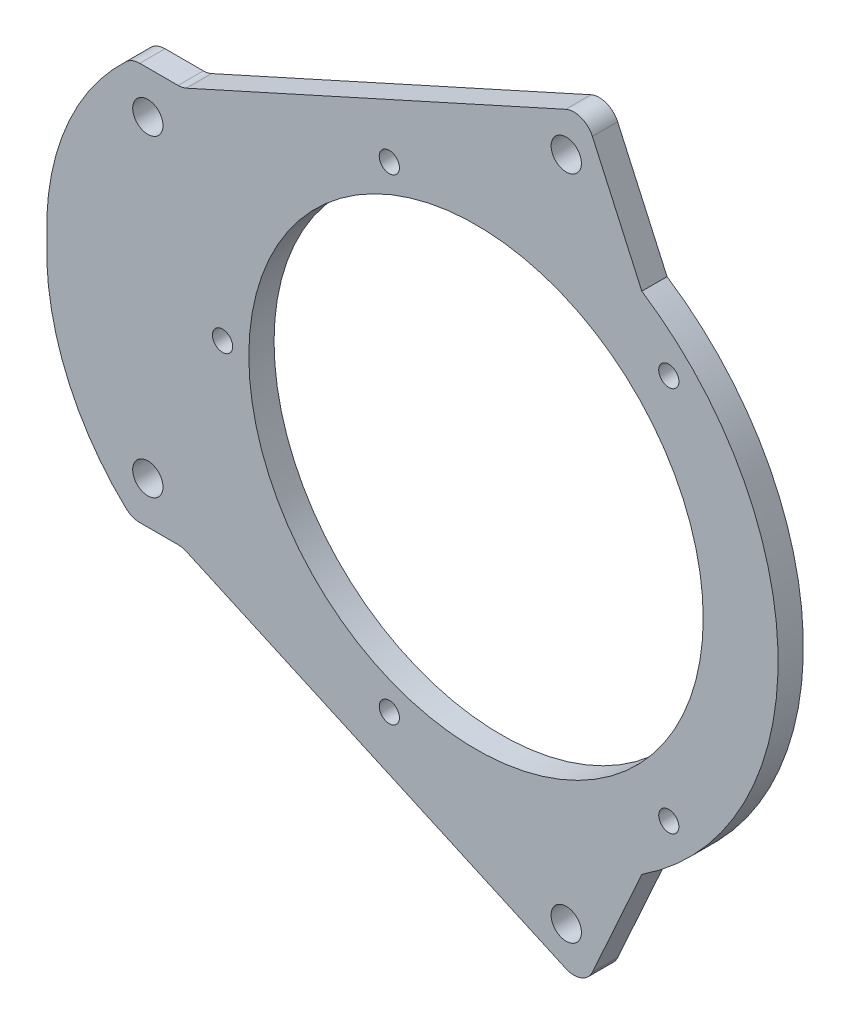
ISO-10303-21;
HEADER;
FILE_DESCRIPTION(('STEP AP214'),'2;1');
FILE_NAME('part.step','',(''),(''),'','','');
FILE_SCHEMA(('AUTOMOTIVE_DESIGN { 1 0 10303 214 1 1 1 1 }'));
ENDSEC;
DATA;
#1=APPLICATION_CONTEXT('core data for automotive mechanical design processes');
#2=APPLICATION_PROTOCOL_DEFINITION('international standard','automotive_design',2000,#1);
#3=PRODUCT_CONTEXT('',#1,'mechanical');
#4=PRODUCT('Part','Part','',(#3));
#5=PRODUCT_RELATED_PRODUCT_CATEGORY('part','',(#4));
#6=PRODUCT_DEFINITION_FORMATION('','',#4);
#7=PRODUCT_DEFINITION_CONTEXT('part definition',#1,'design');
#8=PRODUCT_DEFINITION('design','',#6,#7);
#9=PRODUCT_DEFINITION_SHAPE('','',#8);
#10=(LENGTH_UNIT() NAMED_UNIT(*) SI_UNIT(.MILLI.,.METRE.));
#11=(NAMED_UNIT(*) PLANE_ANGLE_UNIT() SI_UNIT($,.RADIAN.));
#12=(NAMED_UNIT(*) SI_UNIT($,.STERADIAN.) SOLID_ANGLE_UNIT());
#13=UNCERTAINTY_MEASURE_WITH_UNIT(LENGTH_MEASURE(1.E-05),#10,'distance_accuracy_value','');
#14=(GEOMETRIC_REPRESENTATION_CONTEXT(3) GLOBAL_UNCERTAINTY_ASSIGNED_CONTEXT((#13)) GLOBAL_UNIT_ASSIGNED_CONTEXT((#10,
#11,#12)) REPRESENTATION_CONTEXT('',''));
#15=CARTESIAN_POINT('',(0.,0.,0.));
#16=DIRECTION('',(0.,0.,1.));
#17=DIRECTION('',(1.,0.,0.));
#18=AXIS2_PLACEMENT_3D('',#15,#16,#17);
#19=CARTESIAN_POINT('',(-35.4932420101842,-40.0332836997333,2.5));
#20=DIRECTION('',(0.,0.,1.));
#21=DIRECTION('',(1.,0.,0.));
#22=AXIS2_PLACEMENT_3D('',#19,#20,#21);
#23=PLANE('',#22);
#24=CARTESIAN_POINT('',(-102.318076,-15.5,2.5));
#25=DIRECTION('',(0.,0.,1.));
#26=DIRECTION('',(1.,0.,0.));
#27=AXIS2_PLACEMENT_3D('',#24,#25,#26);
#28=CIRCLE('',#27,1.5);
#29=CARTESIAN_POINT('',(-100.818076,-15.5,2.5));
#30=VERTEX_POINT('',#29);
#31=EDGE_CURVE('E369',#30,#30,#28,.T.);
#32=ORIENTED_EDGE('',*,*,#31,.F.);
#33=EDGE_LOOP('',(#32));
#34=FACE_BOUND('',#33,.T.);
#35=CARTESIAN_POINT('',(-102.318076,15.5,2.5));
#36=DIRECTION('',(0.,0.,1.));
#37=DIRECTION('',(-1.,0.,0.));
#38=AXIS2_PLACEMENT_3D('',#35,#36,#37);
#39=CIRCLE('',#38,1.5);
#40=CARTESIAN_POINT('',(-103.818076,15.5,2.5));
#41=VERTEX_POINT('',#40);
#42=EDGE_CURVE('E470',#41,#41,#39,.T.);
#43=ORIENTED_EDGE('',*,*,#42,.F.);
#44=EDGE_LOOP('',(#43));
#45=FACE_BOUND('',#44,.T.);
#46=DIRECTION('',(-1.,0.,0.));
#47=VECTOR('',#46,1.);
#48=CARTESIAN_POINT('',(-98.8886243267286,19.6949884962928,2.5));
#49=LINE('',#48,#47);
#50=CARTESIAN_POINT('',(-99.3194027891663,19.6949884962928,2.5));
#51=VERTEX_POINT('',#50);
#52=CARTESIAN_POINT('',(-103.113561540397,19.6949884962928,2.5));
#53=VERTEX_POINT('',#52);
#54=EDGE_CURVE('E221',#51,#53,#49,.T.);
#55=ORIENTED_EDGE('',*,*,#54,.T.);
#56=CARTESIAN_POINT('',(-103.113561540397,17.6949884962928,2.5));
#57=DIRECTION('',(0.,0.,1.));
#58=DIRECTION('',(1.,0.,0.));
#59=AXIS2_PLACEMENT_3D('',#56,#57,#58);
#60=CIRCLE('',#59,2.);
#61=CARTESIAN_POINT('',(-104.485481090456,19.1502674208176,2.5));
#62=VERTEX_POINT('',#61);
#63=EDGE_CURVE('E200',#53,#62,#60,.T.);
#64=ORIENTED_EDGE('',*,*,#63,.T.);
#65=CARTESIAN_POINT('',(-87.3364867147194,0.959280864257396,2.5));
#66=DIRECTION('',(0.,0.,1.));
#67=DIRECTION('',(-1.,0.,0.));
#68=AXIS2_PLACEMENT_3D('',#65,#66,#67);
#69=CIRCLE('',#68,25.);
#70=CARTESIAN_POINT('',(-112.318075539762,0.,2.5));
#71=VERTEX_POINT('',#70);
#72=EDGE_CURVE('E223',#62,#71,#69,.T.);
#73=ORIENTED_EDGE('',*,*,#72,.T.);
#74=CARTESIAN_POINT('',(-87.3364867147194,-0.959280864257391,2.5));
#75=DIRECTION('',(0.,0.,1.));
#76=DIRECTION('',(1.,0.,0.));
#77=AXIS2_PLACEMENT_3D('',#74,#75,#76);
#78=CIRCLE('',#77,25.);
#79=CARTESIAN_POINT('',(-104.485481090456,-19.1502674208176,2.5));
#80=VERTEX_POINT('',#79);
#81=EDGE_CURVE('E385',#71,#80,#78,.T.);
#82=ORIENTED_EDGE('',*,*,#81,.T.);
#83=CARTESIAN_POINT('',(-103.113561540397,-17.6949884962928,2.5));
#84=DIRECTION('',(0.,0.,1.));
#85=DIRECTION('',(1.,0.,0.));
#86=AXIS2_PLACEMENT_3D('',#83,#84,#85);
#87=CIRCLE('',#86,2.);
#88=CARTESIAN_POINT('',(-103.113561540397,-19.6949884962928,2.5));
#89=VERTEX_POINT('',#88);
#90=EDGE_CURVE('E198',#80,#89,#87,.T.);
#91=ORIENTED_EDGE('',*,*,#90,.T.);
#92=DIRECTION('',(1.,0.,0.));
#93=VECTOR('',#92,1.);
#94=CARTESIAN_POINT('',(-98.8886243267286,-19.6949884962928,2.5));
#95=LINE('',#94,#93);
#96=CARTESIAN_POINT('',(-99.3194027891664,-19.6949884962928,2.5));
#97=VERTEX_POINT('',#96);
#98=EDGE_CURVE('E192',#89,#97,#95,.T.);
#99=ORIENTED_EDGE('',*,*,#98,.T.);
#100=CARTESIAN_POINT('',(-99.3194027891664,-21.6949884962928,2.5));
#101=DIRECTION('',(0.,0.,1.));
#102=DIRECTION('',(1.,0.,0.));
#103=AXIS2_PLACEMENT_3D('',#100,#101,#102);
#104=CIRCLE('',#103,2.);
#105=CARTESIAN_POINT('',(-98.4960435739133,-19.8723312046832,2.5));
#106=VERTEX_POINT('',#105);
#107=EDGE_CURVE('E40',#97,#106,#104,.F.);
#108=ORIENTED_EDGE('',*,*,#107,.T.);
#109=DIRECTION('',(0.911328645804831,-0.411679607626528,0.));
#110=VECTOR('',#109,1.);
#111=CARTESIAN_POINT('',(-99.1994919001305,-19.5545585413792,2.5));
#112=LINE('',#111,#110);
#113=CARTESIAN_POINT('',(-82.1340306035882,-27.2636352206508,2.5));
#114=VERTEX_POINT('',#113);
#115=EDGE_CURVE('E174',#106,#114,#112,.T.);
#116=ORIENTED_EDGE('',*,*,#115,.T.);
#117=DIRECTION('',(0.91132864592297,-0.411679607365006,0.));
#118=VECTOR('',#117,1.);
#119=CARTESIAN_POINT('',(-82.1340306035882,-27.2636352206508,2.5));
#120=LINE('',#119,#118);
#121=CARTESIAN_POINT('',(-60.9376938033347,-36.8387754848606,2.5));
#122=VERTEX_POINT('',#121);
#123=EDGE_CURVE('E293',#114,#122,#120,.T.);
#124=ORIENTED_EDGE('',*,*,#123,.T.);
#125=CARTESIAN_POINT('',(-60.1143345908294,-35.0161181993336,2.5));
#126=DIRECTION('',(0.,0.,1.));
#127=DIRECTION('',(1.,0.,0.));
#128=AXIS2_PLACEMENT_3D('',#125,#126,#127);
#129=CIRCLE('',#128,2.);
#130=CARTESIAN_POINT('',(-58.2916772989834,-35.8394774140636,2.5));
#131=VERTEX_POINT('',#130);
#132=EDGE_CURVE('E194',#122,#131,#129,.T.);
#133=ORIENTED_EDGE('',*,*,#132,.T.);
#134=DIRECTION('',(0.411679607365006,0.91132864592297,0.));
#135=VECTOR('',#134,1.);
#136=CARTESIAN_POINT('',(-53.3986236751587,-25.007801874024,2.5));
#137=LINE('',#136,#135);
#138=CARTESIAN_POINT('',(-53.3986236751587,-25.007801874024,2.5));
#139=VERTEX_POINT('',#138);
#140=EDGE_CURVE('E291',#131,#139,#137,.T.);
#141=ORIENTED_EDGE('',*,*,#140,.T.);
#142=CARTESIAN_POINT('',(-69.8180755397615,2.08537956513715E-08,2.5));
#143=DIRECTION('',(0.,0.,-1.));
#144=DIRECTION('',(1.,0.,0.));
#145=AXIS2_PLACEMENT_3D('',#142,#143,#144);
#146=CIRCLE('',#145,29.9163593135747);
#147=CARTESIAN_POINT('',(-53.3986236751587,25.007801874024,2.5));
#148=VERTEX_POINT('',#147);
#149=EDGE_CURVE('E306',#148,#139,#146,.T.);
#150=ORIENTED_EDGE('',*,*,#149,.F.);
#151=DIRECTION('',(-0.411679607365006,0.91132864592297,0.));
#152=VECTOR('',#151,1.);
#153=CARTESIAN_POINT('',(-53.3986236751587,25.007801874024,2.5));
#154=LINE('',#153,#152);
#155=CARTESIAN_POINT('',(-58.2916772989834,35.8394774140636,2.5));
#156=VERTEX_POINT('',#155);
#157=EDGE_CURVE('E162',#148,#156,#154,.T.);
#158=ORIENTED_EDGE('',*,*,#157,.T.);
#159=CARTESIAN_POINT('',(-60.1143345908294,35.0161181993336,2.5));
#160=DIRECTION('',(0.,0.,1.));
#161=DIRECTION('',(1.,0.,0.));
#162=AXIS2_PLACEMENT_3D('',#159,#160,#161);
#163=CIRCLE('',#162,2.);
#164=CARTESIAN_POINT('',(-60.9376938033347,36.8387754848606,2.5));
#165=VERTEX_POINT('',#164);
#166=EDGE_CURVE('E159',#156,#165,#163,.T.);
#167=ORIENTED_EDGE('',*,*,#166,.T.);
#168=DIRECTION('',(-0.91132864592297,-0.411679607365006,0.));
#169=VECTOR('',#168,1.);
#170=CARTESIAN_POINT('',(-82.1340306035882,27.2636352206508,2.5));
#171=LINE('',#170,#169);
#172=CARTESIAN_POINT('',(-82.1340306022796,27.263635217754,2.5));
#173=VERTEX_POINT('',#172);
#174=EDGE_CURVE('E152',#165,#173,#171,.T.);
#175=ORIENTED_EDGE('',*,*,#174,.T.);
#176=DIRECTION('',(-0.911328645804831,-0.411679607626528,0.));
#177=VECTOR('',#176,1.);
#178=CARTESIAN_POINT('',(-99.1994919001304,19.5545585413792,2.5));
#179=LINE('',#178,#177);
#180=CARTESIAN_POINT('',(-98.4960435739133,19.8723312046832,2.5));
#181=VERTEX_POINT('',#180);
#182=EDGE_CURVE('E156',#173,#181,#179,.T.);
#183=ORIENTED_EDGE('',*,*,#182,.T.);
#184=CARTESIAN_POINT('',(-99.3194027891663,21.6949884962928,2.5));
#185=DIRECTION('',(0.,0.,1.));
#186=DIRECTION('',(1.,0.,0.));
#187=AXIS2_PLACEMENT_3D('',#184,#185,#186);
#188=CIRCLE('',#187,2.);
#189=EDGE_CURVE('E236',#181,#51,#188,.F.);
#190=ORIENTED_EDGE('',*,*,#189,.T.);
#191=EDGE_LOOP('',(#55,#64,#73,#82,#91,#99,#108,#116,#124,#133,#141,#150,#158,#167,#175,#183,#190));
#192=FACE_BOUND('',#191,.T.);
#193=CARTESIAN_POINT('',(-69.8180755397615,2.08537956513715E-08,2.5));
#194=DIRECTION('',(0.,0.,1.));
#195=DIRECTION('',(1.,0.,0.));
#196=AXIS2_PLACEMENT_3D('',#193,#194,#195);
#197=CIRCLE('',#196,22.5);
#198=CARTESIAN_POINT('',(-47.3180755397615,2.08537956513715E-08,2.5));
#199=VERTEX_POINT('',#198);
#200=EDGE_CURVE('E314',#199,#199,#197,.T.);
#201=ORIENTED_EDGE('',*,*,#200,.F.);
#202=EDGE_LOOP('',(#201));
#203=FACE_BOUND('',#202,.T.);
#204=CARTESIAN_POINT('',(-50.7261924477247,19.0918831128906,2.5));
#205=DIRECTION('',(0.,0.,1.));
#206=DIRECTION('',(1.,0.,0.));
#207=AXIS2_PLACEMENT_3D('',#204,#205,#206);
#208=CIRCLE('',#207,0.999999999999998);
#209=CARTESIAN_POINT('',(-49.7261924477247,19.0918831128906,2.5));
#210=VERTEX_POINT('',#209);
#211=EDGE_CURVE('E315',#210,#210,#208,.T.);
#212=ORIENTED_EDGE('',*,*,#211,.F.);
#213=EDGE_LOOP('',(#212));
#214=FACE_BOUND('',#213,.T.);
#215=CARTESIAN_POINT('',(-94.9180755397615,2.08537978552137E-08,2.5));
#216=DIRECTION('',(0.,0.,1.));
#217=DIRECTION('',(1.,0.,0.));
#218=AXIS2_PLACEMENT_3D('',#215,#216,#217);
#219=CIRCLE('',#218,0.999999999999998);
#220=CARTESIAN_POINT('',(-93.9180755397615,2.08537978552137E-08,2.5));
#221=VERTEX_POINT('',#220);
#222=EDGE_CURVE('E321',#221,#221,#219,.T.);
#223=ORIENTED_EDGE('',*,*,#222,.F.);
#224=EDGE_LOOP('',(#223));
#225=FACE_BOUND('',#224,.T.);
#226=CARTESIAN_POINT('',(-50.7261924477247,-19.091883071183,2.5));
#227=DIRECTION('',(0.,0.,1.));
#228=DIRECTION('',(-1.,0.,0.));
#229=AXIS2_PLACEMENT_3D('',#226,#227,#228);
#230=CIRCLE('',#229,0.999999999999998);
#231=CARTESIAN_POINT('',(-51.7261924477247,-19.091883071183,2.5));
#232=VERTEX_POINT('',#231);
#233=EDGE_CURVE('E327',#232,#232,#230,.T.);
#234=ORIENTED_EDGE('',*,*,#233,.F.);
#235=EDGE_LOOP('',(#234));
#236=FACE_BOUND('',#235,.T.);
#237=CARTESIAN_POINT('',(-78.4027811372359,-23.5862847608724,2.5));
#238=DIRECTION('',(0.,0.,1.));
#239=DIRECTION('',(-1.,0.,0.));
#240=AXIS2_PLACEMENT_3D('',#237,#238,#239);
#241=CIRCLE('',#240,0.999999999999998);
#242=CARTESIAN_POINT('',(-79.4027811372359,-23.5862847608724,2.5));
#243=VERTEX_POINT('',#242);
#244=EDGE_CURVE('E333',#243,#243,#241,.T.);
#245=ORIENTED_EDGE('',*,*,#244,.F.);
#246=EDGE_LOOP('',(#245));
#247=FACE_BOUND('',#246,.T.);
#248=CARTESIAN_POINT('',(-78.4027811372359,23.58628480258,2.5));
#249=DIRECTION('',(0.,0.,1.));
#250=DIRECTION('',(1.,0.,0.));
#251=AXIS2_PLACEMENT_3D('',#248,#249,#250);
#252=CIRCLE('',#251,0.999999999999998);
#253=CARTESIAN_POINT('',(-77.4027811372359,23.58628480258,2.5));
#254=VERTEX_POINT('',#253);
#255=EDGE_CURVE('E309',#254,#254,#252,.T.);
#256=ORIENTED_EDGE('',*,*,#255,.F.);
#257=EDGE_LOOP('',(#256));
#258=FACE_BOUND('',#257,.T.);
#259=CARTESIAN_POINT('',(-60.881562627854,-32.9845941624984,2.5));
#260=DIRECTION('',(0.,0.,1.));
#261=DIRECTION('',(1.,0.,0.));
#262=AXIS2_PLACEMENT_3D('',#259,#260,#261);
#263=CIRCLE('',#262,1.50000000627284);
#264=CARTESIAN_POINT('',(-59.3815626215812,-32.9845941624984,2.5));
#265=VERTEX_POINT('',#264);
#266=EDGE_CURVE('E207',#265,#265,#263,.T.);
#267=ORIENTED_EDGE('',*,*,#266,.F.);
#268=EDGE_LOOP('',(#267));
#269=FACE_BOUND('',#268,.T.);
#270=CARTESIAN_POINT('',(-60.881562627854,32.9845941624984,2.5));
#271=DIRECTION('',(0.,0.,1.));
#272=DIRECTION('',(-1.,0.,0.));
#273=AXIS2_PLACEMENT_3D('',#270,#271,#272);
#274=CIRCLE('',#273,1.5);
#275=CARTESIAN_POINT('',(-62.381562627854,32.9845941624984,2.5));
#276=VERTEX_POINT('',#275);
#277=EDGE_CURVE('E163',#276,#276,#274,.T.);
#278=ORIENTED_EDGE('',*,*,#277,.F.);
#279=EDGE_LOOP('',(#278));
#280=FACE_BOUND('',#279,.T.);
#281=ADVANCED_FACE('F32',(#34,#45,#192,#203,#214,#225,#236,#247,#258,#269,#280),#23,.T.);
#282=CARTESIAN_POINT('',(-35.4932420101842,-40.0332836997333,0.));
#283=DIRECTION('',(0.,0.,1.));
#284=DIRECTION('',(1.,0.,0.));
#285=AXIS2_PLACEMENT_3D('',#282,#283,#284);
#286=PLANE('',#285);
#287=CARTESIAN_POINT('',(-102.318076,-15.5,0.));
#288=DIRECTION('',(0.,0.,1.));
#289=DIRECTION('',(1.,0.,0.));
#290=AXIS2_PLACEMENT_3D('',#287,#288,#289);
#291=CIRCLE('',#290,1.5);
#292=CARTESIAN_POINT('',(-100.818076,-15.5,0.));
#293=VERTEX_POINT('',#292);
#294=EDGE_CURVE('E366',#293,#293,#291,.F.);
#295=ORIENTED_EDGE('',*,*,#294,.F.);
#296=EDGE_LOOP('',(#295));
#297=FACE_BOUND('',#296,.T.);
#298=CARTESIAN_POINT('',(-102.318076,15.5,0.));
#299=DIRECTION('',(0.,0.,1.));
#300=DIRECTION('',(1.,0.,0.));
#301=AXIS2_PLACEMENT_3D('',#298,#299,#300);
#302=CIRCLE('',#301,1.5);
#303=CARTESIAN_POINT('',(-100.818076,15.5,0.));
#304=VERTEX_POINT('',#303);
#305=EDGE_CURVE('E467',#304,#304,#302,.F.);
#306=ORIENTED_EDGE('',*,*,#305,.F.);
#307=EDGE_LOOP('',(#306));
#308=FACE_BOUND('',#307,.T.);
#309=CARTESIAN_POINT('',(-69.8180755397615,2.08537956513715E-08,0.));
#310=DIRECTION('',(0.,0.,1.));
#311=DIRECTION('',(1.,0.,0.));
#312=AXIS2_PLACEMENT_3D('',#309,#310,#311);
#313=CIRCLE('',#312,22.5);
#314=CARTESIAN_POINT('',(-47.3180755397615,2.08537956513715E-08,0.));
#315=VERTEX_POINT('',#314);
#316=EDGE_CURVE('E191',#315,#315,#313,.T.);
#317=ORIENTED_EDGE('',*,*,#316,.T.);
#318=EDGE_LOOP('',(#317));
#319=FACE_BOUND('',#318,.T.);
#320=CARTESIAN_POINT('',(-50.7261924477247,19.0918831128906,0.));
#321=DIRECTION('',(0.,0.,1.));
#322=DIRECTION('',(1.,0.,0.));
#323=AXIS2_PLACEMENT_3D('',#320,#321,#322);
#324=CIRCLE('',#323,0.999999999999998);
#325=CARTESIAN_POINT('',(-49.7261924477247,19.0918831128906,0.));
#326=VERTEX_POINT('',#325);
#327=EDGE_CURVE('E311',#326,#326,#324,.T.);
#328=ORIENTED_EDGE('',*,*,#327,.T.);
#329=EDGE_LOOP('',(#328));
#330=FACE_BOUND('',#329,.T.);
#331=CARTESIAN_POINT('',(-94.9180755397615,2.08537978552137E-08,0.));
#332=DIRECTION('',(0.,0.,1.));
#333=DIRECTION('',(1.,0.,0.));
#334=AXIS2_PLACEMENT_3D('',#331,#332,#333);
#335=CIRCLE('',#334,0.999999999999998);
#336=CARTESIAN_POINT('',(-93.9180755397615,2.08537978552137E-08,0.));
#337=VERTEX_POINT('',#336);
#338=EDGE_CURVE('E318',#337,#337,#335,.T.);
#339=ORIENTED_EDGE('',*,*,#338,.T.);
#340=EDGE_LOOP('',(#339));
#341=FACE_BOUND('',#340,.T.);
#342=CARTESIAN_POINT('',(-50.7261924477247,-19.091883071183,0.));
#343=DIRECTION('',(0.,0.,1.));
#344=DIRECTION('',(-1.,0.,0.));
#345=AXIS2_PLACEMENT_3D('',#342,#343,#344);
#346=CIRCLE('',#345,0.999999999999998);
#347=CARTESIAN_POINT('',(-51.7261924477247,-19.091883071183,0.));
#348=VERTEX_POINT('',#347);
#349=EDGE_CURVE('E324',#348,#348,#346,.T.);
#350=ORIENTED_EDGE('',*,*,#349,.T.);
#351=EDGE_LOOP('',(#350));
#352=FACE_BOUND('',#351,.T.);
#353=CARTESIAN_POINT('',(-78.4027811372359,-23.5862847608724,0.));
#354=DIRECTION('',(0.,0.,1.));
#355=DIRECTION('',(-1.,0.,0.));
#356=AXIS2_PLACEMENT_3D('',#353,#354,#355);
#357=CIRCLE('',#356,0.999999999999998);
#358=CARTESIAN_POINT('',(-79.4027811372359,-23.5862847608724,0.));
#359=VERTEX_POINT('',#358);
#360=EDGE_CURVE('E330',#359,#359,#357,.T.);
#361=ORIENTED_EDGE('',*,*,#360,.T.);
#362=EDGE_LOOP('',(#361));
#363=FACE_BOUND('',#362,.T.);
#364=CARTESIAN_POINT('',(-78.4027811372359,23.58628480258,0.));
#365=DIRECTION('',(0.,0.,1.));
#366=DIRECTION('',(1.,0.,0.));
#367=AXIS2_PLACEMENT_3D('',#364,#365,#366);
#368=CIRCLE('',#367,0.999999999999998);
#369=CARTESIAN_POINT('',(-77.4027811372359,23.58628480258,0.));
#370=VERTEX_POINT('',#369);
#371=EDGE_CURVE('E336',#370,#370,#368,.T.);
#372=ORIENTED_EDGE('',*,*,#371,.T.);
#373=EDGE_LOOP('',(#372));
#374=FACE_BOUND('',#373,.T.);
#375=CARTESIAN_POINT('',(-87.3364867147194,0.959280864257396,0.));
#376=DIRECTION('',(0.,0.,1.));
#377=DIRECTION('',(1.,0.,0.));
#378=AXIS2_PLACEMENT_3D('',#375,#376,#377);
#379=CIRCLE('',#378,25.);
#380=CARTESIAN_POINT('',(-112.318075539762,0.,0.));
#381=VERTEX_POINT('',#380);
#382=CARTESIAN_POINT('',(-104.485481090456,19.1502674208176,0.));
#383=VERTEX_POINT('',#382);
#384=EDGE_CURVE('E219',#381,#383,#379,.F.);
#385=ORIENTED_EDGE('',*,*,#384,.T.);
#386=CARTESIAN_POINT('',(-103.113561540397,17.6949884962928,0.));
#387=DIRECTION('',(0.,0.,1.));
#388=DIRECTION('',(1.,0.,0.));
#389=AXIS2_PLACEMENT_3D('',#386,#387,#388);
#390=CIRCLE('',#389,2.);
#391=CARTESIAN_POINT('',(-103.113561540397,19.6949884962928,0.));
#392=VERTEX_POINT('',#391);
#393=EDGE_CURVE('E262',#383,#392,#390,.F.);
#394=ORIENTED_EDGE('',*,*,#393,.T.);
#395=DIRECTION('',(1.,0.,0.));
#396=VECTOR('',#395,1.);
#397=CARTESIAN_POINT('',(-98.8886243267286,19.6949884962928,0.));
#398=LINE('',#397,#396);
#399=CARTESIAN_POINT('',(-99.3194027891663,19.6949884962928,0.));
#400=VERTEX_POINT('',#399);
#401=EDGE_CURVE('E216',#392,#400,#398,.T.);
#402=ORIENTED_EDGE('',*,*,#401,.T.);
#403=CARTESIAN_POINT('',(-99.3194027891663,21.6949884962928,0.));
#404=DIRECTION('',(0.,0.,1.));
#405=DIRECTION('',(1.,0.,0.));
#406=AXIS2_PLACEMENT_3D('',#403,#404,#405);
#407=CIRCLE('',#406,2.);
#408=CARTESIAN_POINT('',(-98.4960435739133,19.8723312046832,0.));
#409=VERTEX_POINT('',#408);
#410=EDGE_CURVE('E238',#400,#409,#407,.T.);
#411=ORIENTED_EDGE('',*,*,#410,.T.);
#412=DIRECTION('',(-0.911328645804831,-0.411679607626528,0.));
#413=VECTOR('',#412,1.);
#414=CARTESIAN_POINT('',(-99.1994919001304,19.5545585413792,0.));
#415=LINE('',#414,#413);
#416=CARTESIAN_POINT('',(-82.1340306022796,27.263635217754,0.));
#417=VERTEX_POINT('',#416);
#418=EDGE_CURVE('E169',#417,#409,#415,.T.);
#419=ORIENTED_EDGE('',*,*,#418,.F.);
#420=DIRECTION('',(0.91132864592297,0.411679607365006,0.));
#421=VECTOR('',#420,1.);
#422=CARTESIAN_POINT('',(-82.1340306035882,27.2636352206508,0.));
#423=LINE('',#422,#421);
#424=CARTESIAN_POINT('',(-60.9376938033347,36.8387754848606,0.));
#425=VERTEX_POINT('',#424);
#426=EDGE_CURVE('E372',#417,#425,#423,.T.);
#427=ORIENTED_EDGE('',*,*,#426,.T.);
#428=CARTESIAN_POINT('',(-60.1143345908294,35.0161181993336,0.));
#429=DIRECTION('',(0.,0.,1.));
#430=DIRECTION('',(1.,0.,0.));
#431=AXIS2_PLACEMENT_3D('',#428,#429,#430);
#432=CIRCLE('',#431,2.);
#433=CARTESIAN_POINT('',(-58.2916772989834,35.8394774140636,0.));
#434=VERTEX_POINT('',#433);
#435=EDGE_CURVE('E264',#425,#434,#432,.F.);
#436=ORIENTED_EDGE('',*,*,#435,.T.);
#437=DIRECTION('',(0.411679607365006,-0.91132864592297,0.));
#438=VECTOR('',#437,1.);
#439=CARTESIAN_POINT('',(-53.3986236751587,25.007801874024,0.));
#440=LINE('',#439,#438);
#441=CARTESIAN_POINT('',(-53.3986236946436,25.0078019171573,0.));
#442=VERTEX_POINT('',#441);
#443=EDGE_CURVE('E379',#434,#442,#440,.T.);
#444=ORIENTED_EDGE('',*,*,#443,.T.);
#445=CARTESIAN_POINT('',(-69.8180755397615,2.08537956513715E-08,0.));
#446=DIRECTION('',(0.,0.,-1.));
#447=DIRECTION('',(1.,0.,0.));
#448=AXIS2_PLACEMENT_3D('',#445,#446,#447);
#449=CIRCLE('',#448,29.9163593135747);
#450=CARTESIAN_POINT('',(-53.3986236751587,-25.007801874024,0.));
#451=VERTEX_POINT('',#450);
#452=EDGE_CURVE('E307',#442,#451,#449,.T.);
#453=ORIENTED_EDGE('',*,*,#452,.T.);
#454=DIRECTION('',(-0.411679607365006,-0.91132864592297,0.));
#455=VECTOR('',#454,1.);
#456=CARTESIAN_POINT('',(-53.3986236751587,-25.007801874024,0.));
#457=LINE('',#456,#455);
#458=CARTESIAN_POINT('',(-58.2916772989834,-35.8394774140636,0.));
#459=VERTEX_POINT('',#458);
#460=EDGE_CURVE('E278',#451,#459,#457,.T.);
#461=ORIENTED_EDGE('',*,*,#460,.T.);
#462=CARTESIAN_POINT('',(-60.1143345908294,-35.0161181993336,0.));
#463=DIRECTION('',(0.,0.,1.));
#464=DIRECTION('',(1.,0.,0.));
#465=AXIS2_PLACEMENT_3D('',#462,#463,#464);
#466=CIRCLE('',#465,2.);
#467=CARTESIAN_POINT('',(-60.9376938033347,-36.8387754848606,0.));
#468=VERTEX_POINT('',#467);
#469=EDGE_CURVE('E203',#459,#468,#466,.F.);
#470=ORIENTED_EDGE('',*,*,#469,.T.);
#471=DIRECTION('',(-0.91132864592297,0.411679607365006,0.));
#472=VECTOR('',#471,1.);
#473=CARTESIAN_POINT('',(-82.1340306035882,-27.2636352206508,0.));
#474=LINE('',#473,#472);
#475=CARTESIAN_POINT('',(-82.1340306035882,-27.263635199797,0.));
#476=VERTEX_POINT('',#475);
#477=EDGE_CURVE('E276',#468,#476,#474,.T.);
#478=ORIENTED_EDGE('',*,*,#477,.T.);
#479=DIRECTION('',(0.911328645804831,-0.411679607626528,0.));
#480=VECTOR('',#479,1.);
#481=CARTESIAN_POINT('',(-99.1994919001305,-19.5545585413792,0.));
#482=LINE('',#481,#480);
#483=CARTESIAN_POINT('',(-98.4960435739133,-19.8723312046832,0.));
#484=VERTEX_POINT('',#483);
#485=EDGE_CURVE('E170',#484,#476,#482,.T.);
#486=ORIENTED_EDGE('',*,*,#485,.F.);
#487=CARTESIAN_POINT('',(-99.3194027891664,-21.6949884962928,0.));
#488=DIRECTION('',(0.,0.,1.));
#489=DIRECTION('',(1.,0.,0.));
#490=AXIS2_PLACEMENT_3D('',#487,#488,#489);
#491=CIRCLE('',#490,2.);
#492=CARTESIAN_POINT('',(-99.3194027891664,-19.6949884962928,0.));
#493=VERTEX_POINT('',#492);
#494=EDGE_CURVE('E11',#484,#493,#491,.T.);
#495=ORIENTED_EDGE('',*,*,#494,.T.);
#496=DIRECTION('',(-1.,0.,0.));
#497=VECTOR('',#496,1.);
#498=CARTESIAN_POINT('',(-98.8886243267286,-19.6949884962928,0.));
#499=LINE('',#498,#497);
#500=CARTESIAN_POINT('',(-103.113561540397,-19.6949884962928,0.));
#501=VERTEX_POINT('',#500);
#502=EDGE_CURVE('E205',#493,#501,#499,.T.);
#503=ORIENTED_EDGE('',*,*,#502,.T.);
#504=CARTESIAN_POINT('',(-103.113561540397,-17.6949884962928,0.));
#505=DIRECTION('',(0.,0.,1.));
#506=DIRECTION('',(1.,0.,0.));
#507=AXIS2_PLACEMENT_3D('',#504,#505,#506);
#508=CIRCLE('',#507,2.);
#509=CARTESIAN_POINT('',(-104.485481090456,-19.1502674208176,0.));
#510=VERTEX_POINT('',#509);
#511=EDGE_CURVE('E47',#501,#510,#508,.F.);
#512=ORIENTED_EDGE('',*,*,#511,.T.);
#513=CARTESIAN_POINT('',(-87.3364867147194,-0.959280864257391,0.));
#514=DIRECTION('',(0.,0.,1.));
#515=DIRECTION('',(1.,0.,0.));
#516=AXIS2_PLACEMENT_3D('',#513,#514,#515);
#517=CIRCLE('',#516,25.);
#518=EDGE_CURVE('E208',#510,#381,#517,.F.);
#519=ORIENTED_EDGE('',*,*,#518,.T.);
#520=EDGE_LOOP('',(#385,#394,#402,#411,#419,#427,#436,#444,#453,#461,#470,#478,#486,#495,#503,
#512,#519));
#521=FACE_BOUND('',#520,.T.);
#522=CARTESIAN_POINT('',(-60.881562627854,-32.9845941624984,0.));
#523=DIRECTION('',(0.,0.,1.));
#524=DIRECTION('',(1.,0.,0.));
#525=AXIS2_PLACEMENT_3D('',#522,#523,#524);
#526=CIRCLE('',#525,1.50000000627284);
#527=CARTESIAN_POINT('',(-59.3815626215812,-32.9845941624984,0.));
#528=VERTEX_POINT('',#527);
#529=EDGE_CURVE('E287',#528,#528,#526,.F.);
#530=ORIENTED_EDGE('',*,*,#529,.F.);
#531=EDGE_LOOP('',(#530));
#532=FACE_BOUND('',#531,.T.);
#533=CARTESIAN_POINT('',(-60.881562627854,32.9845941624984,0.));
#534=DIRECTION('',(0.,0.,1.));
#535=DIRECTION('',(1.,0.,0.));
#536=AXIS2_PLACEMENT_3D('',#533,#534,#535);
#537=CIRCLE('',#536,1.5);
#538=CARTESIAN_POINT('',(-59.3815626278541,32.9845941624984,0.));
#539=VERTEX_POINT('',#538);
#540=EDGE_CURVE('E224',#539,#539,#537,.F.);
#541=ORIENTED_EDGE('',*,*,#540,.F.);
#542=EDGE_LOOP('',(#541));
#543=FACE_BOUND('',#542,.T.);
#544=ADVANCED_FACE('F273',(#297,#308,#319,#330,#341,#352,#363,#374,#521,#532,#543),#286,.F.);
#545=CARTESIAN_POINT('',(-99.1994919001304,19.5545585413792,0.));
#546=DIRECTION('',(-0.411679607626529,0.911328645804831,0.));
#547=DIRECTION('',(-0.911328645804831,-0.411679607626529,0.));
#548=AXIS2_PLACEMENT_3D('',#545,#546,#547);
#549=PLANE('',#548);
#550=ORIENTED_EDGE('',*,*,#418,.T.);
#551=DIRECTION('',(0.,0.,-1.));
#552=VECTOR('',#551,1.);
#553=CARTESIAN_POINT('',(-98.4960435739133,19.8723312046832,2.5));
#554=LINE('',#553,#552);
#555=EDGE_CURVE('E168',#409,#181,#554,.F.);
#556=ORIENTED_EDGE('',*,*,#555,.T.);
#557=ORIENTED_EDGE('',*,*,#182,.F.);
#558=ORIENTED_EDGE('',*,*,#174,.F.);
#559=DIRECTION('',(0.,0.,1.));
#560=VECTOR('',#559,1.);
#561=CARTESIAN_POINT('',(-60.9376938060825,36.8387754909432,0.));
#562=LINE('',#561,#560);
#563=EDGE_CURVE('E260',#165,#425,#562,.F.);
#564=ORIENTED_EDGE('',*,*,#563,.T.);
#565=ORIENTED_EDGE('',*,*,#426,.F.);
#566=EDGE_LOOP('',(#550,#556,#557,#558,#564,#565));
#567=FACE_BOUND('',#566,.T.);
#568=ADVANCED_FACE('F166',(#567),#549,.T.);
#569=CARTESIAN_POINT('',(-99.1994919001305,-19.5545585413792,0.));
#570=DIRECTION('',(-0.411679607626528,-0.911328645804831,0.));
#571=DIRECTION('',(0.911328645804831,-0.411679607626528,0.));
#572=AXIS2_PLACEMENT_3D('',#569,#570,#571);
#573=PLANE('',#572);
#574=ORIENTED_EDGE('',*,*,#115,.F.);
#575=DIRECTION('',(0.,0.,1.));
#576=VECTOR('',#575,1.);
#577=CARTESIAN_POINT('',(-98.4960435739133,-19.8723312046832,0.));
#578=LINE('',#577,#576);
#579=EDGE_CURVE('E247',#106,#484,#578,.F.);
#580=ORIENTED_EDGE('',*,*,#579,.T.);
#581=ORIENTED_EDGE('',*,*,#485,.T.);
#582=ORIENTED_EDGE('',*,*,#477,.F.);
#583=DIRECTION('',(0.,0.,1.));
#584=VECTOR('',#583,1.);
#585=CARTESIAN_POINT('',(-60.9376938060824,-36.8387754909432,0.));
#586=LINE('',#585,#584);
#587=EDGE_CURVE('E249',#468,#122,#586,.T.);
#588=ORIENTED_EDGE('',*,*,#587,.T.);
#589=ORIENTED_EDGE('',*,*,#123,.F.);
#590=EDGE_LOOP('',(#574,#580,#581,#582,#588,#589));
#591=FACE_BOUND('',#590,.T.);
#592=ADVANCED_FACE('F284',(#591),#573,.T.);
#593=CARTESIAN_POINT('',(-69.8180755397615,2.08537956513715E-08,0.));
#594=DIRECTION('',(0.,0.,1.));
#595=DIRECTION('',(1.,0.,0.));
#596=AXIS2_PLACEMENT_3D('',#593,#594,#595);
#597=CYLINDRICAL_SURFACE('',#596,22.5);
#598=ORIENTED_EDGE('',*,*,#316,.F.);
#599=EDGE_LOOP('',(#598));
#600=FACE_BOUND('',#599,.T.);
#601=ORIENTED_EDGE('',*,*,#200,.T.);
#602=EDGE_LOOP('',(#601));
#603=FACE_BOUND('',#602,.T.);
#604=ADVANCED_FACE('F345',(#600,#603),#597,.F.);
#605=CARTESIAN_POINT('',(-50.7261924477247,19.0918831128906,0.));
#606=DIRECTION('',(0.,0.,1.));
#607=DIRECTION('',(1.,0.,0.));
#608=AXIS2_PLACEMENT_3D('',#605,#606,#607);
#609=CYLINDRICAL_SURFACE('',#608,0.999999999999998);
#610=ORIENTED_EDGE('',*,*,#327,.F.);
#611=EDGE_LOOP('',(#610));
#612=FACE_BOUND('',#611,.T.);
#613=ORIENTED_EDGE('',*,*,#211,.T.);
#614=EDGE_LOOP('',(#613));
#615=FACE_BOUND('',#614,.T.);
#616=ADVANCED_FACE('F411',(#612,#615),#609,.F.);
#617=CARTESIAN_POINT('',(-94.9180755397615,2.08537978552137E-08,0.));
#618=DIRECTION('',(0.,0.,1.));
#619=DIRECTION('',(1.,0.,0.));
#620=AXIS2_PLACEMENT_3D('',#617,#618,#619);
#621=CYLINDRICAL_SURFACE('',#620,0.999999999999998);
#622=ORIENTED_EDGE('',*,*,#338,.F.);
#623=EDGE_LOOP('',(#622));
#624=FACE_BOUND('',#623,.T.);
#625=ORIENTED_EDGE('',*,*,#222,.T.);
#626=EDGE_LOOP('',(#625));
#627=FACE_BOUND('',#626,.T.);
#628=ADVANCED_FACE('F414',(#624,#627),#621,.F.);
#629=CARTESIAN_POINT('',(-50.7261924477247,-19.091883071183,0.));
#630=DIRECTION('',(0.,0.,1.));
#631=DIRECTION('',(1.,0.,0.));
#632=AXIS2_PLACEMENT_3D('',#629,#630,#631);
#633=CYLINDRICAL_SURFACE('',#632,0.999999999999998);
#634=ORIENTED_EDGE('',*,*,#349,.F.);
#635=EDGE_LOOP('',(#634));
#636=FACE_BOUND('',#635,.T.);
#637=ORIENTED_EDGE('',*,*,#233,.T.);
#638=EDGE_LOOP('',(#637));
#639=FACE_BOUND('',#638,.T.);
#640=ADVANCED_FACE('F418',(#636,#639),#633,.F.);
#641=CARTESIAN_POINT('',(-78.4027811372359,-23.5862847608724,0.));
#642=DIRECTION('',(0.,0.,1.));
#643=DIRECTION('',(1.,0.,0.));
#644=AXIS2_PLACEMENT_3D('',#641,#642,#643);
#645=CYLINDRICAL_SURFACE('',#644,0.999999999999998);
#646=ORIENTED_EDGE('',*,*,#360,.F.);
#647=EDGE_LOOP('',(#646));
#648=FACE_BOUND('',#647,.T.);
#649=ORIENTED_EDGE('',*,*,#244,.T.);
#650=EDGE_LOOP('',(#649));
#651=FACE_BOUND('',#650,.T.);
#652=ADVANCED_FACE('F422',(#648,#651),#645,.F.);
#653=CARTESIAN_POINT('',(-78.4027811372359,23.58628480258,0.));
#654=DIRECTION('',(0.,0.,1.));
#655=DIRECTION('',(1.,0.,0.));
#656=AXIS2_PLACEMENT_3D('',#653,#654,#655);
#657=CYLINDRICAL_SURFACE('',#656,0.999999999999998);
#658=ORIENTED_EDGE('',*,*,#371,.F.);
#659=EDGE_LOOP('',(#658));
#660=FACE_BOUND('',#659,.T.);
#661=ORIENTED_EDGE('',*,*,#255,.T.);
#662=EDGE_LOOP('',(#661));
#663=FACE_BOUND('',#662,.T.);
#664=ADVANCED_FACE('F409',(#660,#663),#657,.F.);
#665=CARTESIAN_POINT('',(-69.8180755397615,2.08537956513715E-08,0.));
#666=DIRECTION('',(0.,0.,1.));
#667=DIRECTION('',(1.,0.,0.));
#668=AXIS2_PLACEMENT_3D('',#665,#666,#667);
#669=CYLINDRICAL_SURFACE('',#668,29.9163593135747);
#670=ORIENTED_EDGE('',*,*,#452,.F.);
#671=DIRECTION('',(0.,0.,1.));
#672=VECTOR('',#671,1.);
#673=CARTESIAN_POINT('',(-53.3986236751587,25.007801874024,-41.6222931886599));
#674=LINE('',#673,#672);
#675=EDGE_CURVE('E376',#442,#148,#674,.T.);
#676=ORIENTED_EDGE('',*,*,#675,.T.);
#677=ORIENTED_EDGE('',*,*,#149,.T.);
#678=DIRECTION('',(0.,0.,1.));
#679=VECTOR('',#678,1.);
#680=CARTESIAN_POINT('',(-53.3986236751587,-25.007801874024,-41.6222931886599));
#681=LINE('',#680,#679);
#682=EDGE_CURVE('E298',#451,#139,#681,.T.);
#683=ORIENTED_EDGE('',*,*,#682,.F.);
#684=EDGE_LOOP('',(#670,#676,#677,#683));
#685=FACE_BOUND('',#684,.T.);
#686=ADVANCED_FACE('F402',(#685),#669,.T.);
#687=CARTESIAN_POINT('',(-53.3986236751587,-25.007801874024,-41.6222931886599));
#688=DIRECTION('',(0.91132864592297,-0.411679607365006,0.));
#689=DIRECTION('',(0.411679607365006,0.91132864592297,0.));
#690=AXIS2_PLACEMENT_3D('',#687,#688,#689);
#691=PLANE('',#690);
#692=ORIENTED_EDGE('',*,*,#140,.F.);
#693=DIRECTION('',(0.,0.,1.));
#694=VECTOR('',#693,1.);
#695=CARTESIAN_POINT('',(-58.2916772989834,-35.8394774140636,-41.6222931886599));
#696=LINE('',#695,#694);
#697=EDGE_CURVE('E240',#131,#459,#696,.F.);
#698=ORIENTED_EDGE('',*,*,#697,.T.);
#699=ORIENTED_EDGE('',*,*,#460,.F.);
#700=ORIENTED_EDGE('',*,*,#682,.T.);
#701=EDGE_LOOP('',(#692,#698,#699,#700));
#702=FACE_BOUND('',#701,.T.);
#703=ADVANCED_FACE('F296',(#702),#691,.T.);
#704=CARTESIAN_POINT('',(-60.881562627854,-32.9845941624984,-41.6222931886599));
#705=DIRECTION('',(0.,0.,1.));
#706=DIRECTION('',(1.,0.,0.));
#707=AXIS2_PLACEMENT_3D('',#704,#705,#706);
#708=CYLINDRICAL_SURFACE('',#707,1.50000000627284);
#709=ORIENTED_EDGE('',*,*,#529,.T.);
#710=EDGE_LOOP('',(#709));
#711=FACE_BOUND('',#710,.T.);
#712=ORIENTED_EDGE('',*,*,#266,.T.);
#713=EDGE_LOOP('',(#712));
#714=FACE_BOUND('',#713,.T.);
#715=ADVANCED_FACE('F391',(#711,#714),#708,.F.);
#716=CARTESIAN_POINT('',(-98.8886243267286,-19.6949884962928,-41.6222931886599));
#717=DIRECTION('',(0.,-1.,0.));
#718=DIRECTION('',(0.,0.,-1.));
#719=AXIS2_PLACEMENT_3D('',#716,#717,#718);
#720=PLANE('',#719);
#721=ORIENTED_EDGE('',*,*,#98,.F.);
#722=DIRECTION('',(0.,0.,1.));
#723=VECTOR('',#722,1.);
#724=CARTESIAN_POINT('',(-103.113561540397,-19.6949884962928,-41.6222931886599));
#725=LINE('',#724,#723);
#726=EDGE_CURVE('E55',#89,#501,#725,.F.);
#727=ORIENTED_EDGE('',*,*,#726,.T.);
#728=ORIENTED_EDGE('',*,*,#502,.F.);
#729=DIRECTION('',(0.,0.,1.));
#730=VECTOR('',#729,1.);
#731=CARTESIAN_POINT('',(-99.3194027891664,-19.6949884962928,2.5));
#732=LINE('',#731,#730);
#733=EDGE_CURVE('E253',#493,#97,#732,.T.);
#734=ORIENTED_EDGE('',*,*,#733,.T.);
#735=EDGE_LOOP('',(#721,#727,#728,#734));
#736=FACE_BOUND('',#735,.T.);
#737=ADVANCED_FACE('F393',(#736),#720,.T.);
#738=CARTESIAN_POINT('',(-87.3364867147194,-0.959280864257391,-41.6222931886599));
#739=DIRECTION('',(0.,0.,1.));
#740=DIRECTION('',(1.,0.,0.));
#741=AXIS2_PLACEMENT_3D('',#738,#739,#740);
#742=CYLINDRICAL_SURFACE('',#741,25.);
#743=ORIENTED_EDGE('',*,*,#518,.F.);
#744=DIRECTION('',(0.,0.,1.));
#745=VECTOR('',#744,1.);
#746=CARTESIAN_POINT('',(-104.485481090456,-19.1502674208176,-41.6222931886599));
#747=LINE('',#746,#745);
#748=EDGE_CURVE('E256',#510,#80,#747,.T.);
#749=ORIENTED_EDGE('',*,*,#748,.T.);
#750=ORIENTED_EDGE('',*,*,#81,.F.);
#751=DIRECTION('',(0.,0.,1.));
#752=VECTOR('',#751,1.);
#753=CARTESIAN_POINT('',(-112.318075539762,0.,-41.6222931886599));
#754=LINE('',#753,#752);
#755=EDGE_CURVE('E220',#381,#71,#754,.T.);
#756=ORIENTED_EDGE('',*,*,#755,.F.);
#757=EDGE_LOOP('',(#743,#749,#750,#756));
#758=FACE_BOUND('',#757,.T.);
#759=ADVANCED_FACE('F400',(#758),#742,.T.);
#760=CARTESIAN_POINT('',(-87.3364867147194,0.959280864257396,-41.6222931886599));
#761=DIRECTION('',(0.,0.,1.));
#762=DIRECTION('',(1.,0.,0.));
#763=AXIS2_PLACEMENT_3D('',#760,#761,#762);
#764=CYLINDRICAL_SURFACE('',#763,25.);
#765=ORIENTED_EDGE('',*,*,#72,.F.);
#766=DIRECTION('',(0.,0.,1.));
#767=VECTOR('',#766,1.);
#768=CARTESIAN_POINT('',(-104.485481090456,19.1502674208176,-41.6222931886599));
#769=LINE('',#768,#767);
#770=EDGE_CURVE('E202',#62,#383,#769,.F.);
#771=ORIENTED_EDGE('',*,*,#770,.T.);
#772=ORIENTED_EDGE('',*,*,#384,.F.);
#773=ORIENTED_EDGE('',*,*,#755,.T.);
#774=EDGE_LOOP('',(#765,#771,#772,#773));
#775=FACE_BOUND('',#774,.T.);
#776=ADVANCED_FACE('F495',(#775),#764,.T.);
#777=CARTESIAN_POINT('',(-98.8886243267286,19.6949884962928,-41.6222931886599));
#778=DIRECTION('',(0.,1.,0.));
#779=DIRECTION('',(0.,0.,1.));
#780=AXIS2_PLACEMENT_3D('',#777,#778,#779);
#781=PLANE('',#780);
#782=ORIENTED_EDGE('',*,*,#401,.F.);
#783=DIRECTION('',(0.,0.,1.));
#784=VECTOR('',#783,1.);
#785=CARTESIAN_POINT('',(-103.113561540397,19.6949884962928,-41.6222931886599));
#786=LINE('',#785,#784);
#787=EDGE_CURVE('E196',#392,#53,#786,.T.);
#788=ORIENTED_EDGE('',*,*,#787,.T.);
#789=ORIENTED_EDGE('',*,*,#54,.F.);
#790=DIRECTION('',(0.,0.,-1.));
#791=VECTOR('',#790,1.);
#792=CARTESIAN_POINT('',(-99.3194027891663,19.6949884962928,0.));
#793=LINE('',#792,#791);
#794=EDGE_CURVE('E172',#51,#400,#793,.T.);
#795=ORIENTED_EDGE('',*,*,#794,.T.);
#796=EDGE_LOOP('',(#782,#788,#789,#795));
#797=FACE_BOUND('',#796,.T.);
#798=ADVANCED_FACE('F231',(#797),#781,.T.);
#799=CARTESIAN_POINT('',(-53.3986236751587,25.007801874024,-41.6222931886599));
#800=DIRECTION('',(0.91132864592297,0.411679607365006,0.));
#801=DIRECTION('',(-0.411679607365006,0.91132864592297,0.));
#802=AXIS2_PLACEMENT_3D('',#799,#800,#801);
#803=PLANE('',#802);
#804=ORIENTED_EDGE('',*,*,#443,.F.);
#805=DIRECTION('',(0.,0.,1.));
#806=VECTOR('',#805,1.);
#807=CARTESIAN_POINT('',(-58.2916772989834,35.8394774140636,-41.6222931886599));
#808=LINE('',#807,#806);
#809=EDGE_CURVE('E244',#434,#156,#808,.T.);
#810=ORIENTED_EDGE('',*,*,#809,.T.);
#811=ORIENTED_EDGE('',*,*,#157,.F.);
#812=ORIENTED_EDGE('',*,*,#675,.F.);
#813=EDGE_LOOP('',(#804,#810,#811,#812));
#814=FACE_BOUND('',#813,.T.);
#815=ADVANCED_FACE('F463',(#814),#803,.T.);
#816=CARTESIAN_POINT('',(-60.881562627854,32.9845941624984,-41.6222931886599));
#817=DIRECTION('',(0.,0.,1.));
#818=DIRECTION('',(1.,0.,0.));
#819=AXIS2_PLACEMENT_3D('',#816,#817,#818);
#820=CYLINDRICAL_SURFACE('',#819,1.5);
#821=ORIENTED_EDGE('',*,*,#540,.T.);
#822=EDGE_LOOP('',(#821));
#823=FACE_BOUND('',#822,.T.);
#824=ORIENTED_EDGE('',*,*,#277,.T.);
#825=EDGE_LOOP('',(#824));
#826=FACE_BOUND('',#825,.T.);
#827=ADVANCED_FACE('F444',(#823,#826),#820,.F.);
#828=CARTESIAN_POINT('',(-103.113561540397,17.6949884962928,-41.6222931886599));
#829=DIRECTION('',(0.,0.,1.));
#830=DIRECTION('',(1.,0.,0.));
#831=AXIS2_PLACEMENT_3D('',#828,#829,#830);
#832=CYLINDRICAL_SURFACE('',#831,2.);
#833=ORIENTED_EDGE('',*,*,#393,.F.);
#834=ORIENTED_EDGE('',*,*,#770,.F.);
#835=ORIENTED_EDGE('',*,*,#63,.F.);
#836=ORIENTED_EDGE('',*,*,#787,.F.);
#837=EDGE_LOOP('',(#833,#834,#835,#836));
#838=FACE_BOUND('',#837,.T.);
#839=ADVANCED_FACE('F440',(#838),#832,.T.);
#840=CARTESIAN_POINT('',(-99.3194027891663,21.6949884962928,-41.6222931886599));
#841=DIRECTION('',(0.,0.,1.));
#842=DIRECTION('',(1.,0.,0.));
#843=AXIS2_PLACEMENT_3D('',#840,#841,#842);
#844=CYLINDRICAL_SURFACE('',#843,2.);
#845=ORIENTED_EDGE('',*,*,#189,.F.);
#846=ORIENTED_EDGE('',*,*,#555,.F.);
#847=ORIENTED_EDGE('',*,*,#410,.F.);
#848=ORIENTED_EDGE('',*,*,#794,.F.);
#849=EDGE_LOOP('',(#845,#846,#847,#848));
#850=FACE_BOUND('',#849,.T.);
#851=ADVANCED_FACE('F443',(#850),#844,.F.);
#852=CARTESIAN_POINT('',(-103.113561540397,-17.6949884962928,-41.6222931886599));
#853=DIRECTION('',(0.,0.,1.));
#854=DIRECTION('',(1.,0.,0.));
#855=AXIS2_PLACEMENT_3D('',#852,#853,#854);
#856=CYLINDRICAL_SURFACE('',#855,2.);
#857=ORIENTED_EDGE('',*,*,#511,.F.);
#858=ORIENTED_EDGE('',*,*,#726,.F.);
#859=ORIENTED_EDGE('',*,*,#90,.F.);
#860=ORIENTED_EDGE('',*,*,#748,.F.);
#861=EDGE_LOOP('',(#857,#858,#859,#860));
#862=FACE_BOUND('',#861,.T.);
#863=ADVANCED_FACE('F447',(#862),#856,.T.);
#864=CARTESIAN_POINT('',(-99.3194027891664,-21.6949884962928,-41.6222931886599));
#865=DIRECTION('',(0.,0.,-1.));
#866=DIRECTION('',(-1.,0.,0.));
#867=AXIS2_PLACEMENT_3D('',#864,#865,#866);
#868=CYLINDRICAL_SURFACE('',#867,2.);
#869=ORIENTED_EDGE('',*,*,#494,.F.);
#870=ORIENTED_EDGE('',*,*,#579,.F.);
#871=ORIENTED_EDGE('',*,*,#107,.F.);
#872=ORIENTED_EDGE('',*,*,#733,.F.);
#873=EDGE_LOOP('',(#869,#870,#871,#872));
#874=FACE_BOUND('',#873,.T.);
#875=ADVANCED_FACE('F450',(#874),#868,.F.);
#876=CARTESIAN_POINT('',(-60.1143345908294,35.0161181993336,-41.6222931886599));
#877=DIRECTION('',(0.,0.,1.));
#878=DIRECTION('',(1.,0.,0.));
#879=AXIS2_PLACEMENT_3D('',#876,#877,#878);
#880=CYLINDRICAL_SURFACE('',#879,2.);
#881=ORIENTED_EDGE('',*,*,#435,.F.);
#882=ORIENTED_EDGE('',*,*,#563,.F.);
#883=ORIENTED_EDGE('',*,*,#166,.F.);
#884=ORIENTED_EDGE('',*,*,#809,.F.);
#885=EDGE_LOOP('',(#881,#882,#883,#884));
#886=FACE_BOUND('',#885,.T.);
#887=ADVANCED_FACE('F453',(#886),#880,.T.);
#888=CARTESIAN_POINT('',(-60.1143345908294,-35.0161181993336,0.));
#889=DIRECTION('',(0.,0.,1.));
#890=DIRECTION('',(1.,0.,0.));
#891=AXIS2_PLACEMENT_3D('',#888,#889,#890);
#892=CYLINDRICAL_SURFACE('',#891,2.);
#893=ORIENTED_EDGE('',*,*,#469,.F.);
#894=ORIENTED_EDGE('',*,*,#697,.F.);
#895=ORIENTED_EDGE('',*,*,#132,.F.);
#896=ORIENTED_EDGE('',*,*,#587,.F.);
#897=EDGE_LOOP('',(#893,#894,#895,#896));
#898=FACE_BOUND('',#897,.T.);
#899=ADVANCED_FACE('F34',(#898),#892,.T.);
#900=CARTESIAN_POINT('',(-102.318076,15.5,-4.24264068711928));
#901=DIRECTION('',(0.,0.,1.));
#902=DIRECTION('',(1.,0.,0.));
#903=AXIS2_PLACEMENT_3D('',#900,#901,#902);
#904=CYLINDRICAL_SURFACE('',#903,1.5);
#905=ORIENTED_EDGE('',*,*,#305,.T.);
#906=EDGE_LOOP('',(#905));
#907=FACE_BOUND('',#906,.T.);
#908=ORIENTED_EDGE('',*,*,#42,.T.);
#909=EDGE_LOOP('',(#908));
#910=FACE_BOUND('',#909,.T.);
#911=ADVANCED_FACE('F460',(#907,#910),#904,.F.);
#912=CARTESIAN_POINT('',(-102.318076,-15.5,-4.24264068711928));
#913=DIRECTION('',(0.,0.,1.));
#914=DIRECTION('',(1.,0.,0.));
#915=AXIS2_PLACEMENT_3D('',#912,#913,#914);
#916=CYLINDRICAL_SURFACE('',#915,1.5);
#917=ORIENTED_EDGE('',*,*,#294,.T.);
#918=EDGE_LOOP('',(#917));
#919=FACE_BOUND('',#918,.T.);
#920=ORIENTED_EDGE('',*,*,#31,.T.);
#921=EDGE_LOOP('',(#920));
#922=FACE_BOUND('',#921,.T.);
#923=ADVANCED_FACE('F476',(#919,#922),#916,.F.);
#924=CLOSED_SHELL('',(#281,#544,#568,#592,#604,#616,#628,#640,#652,#664,#686,#703,#715,#737,
#759,#776,#798,#815,#827,#839,#851,#863,#875,#887,#899,#911,#923));
#925=MANIFOLD_SOLID_BREP('B2',#924);
#926=ADVANCED_BREP_SHAPE_REPRESENTATION('',(#18,#925),#14);
#927=SHAPE_DEFINITION_REPRESENTATION(#9,#926);
ENDSEC;
END-ISO-10303-21;
